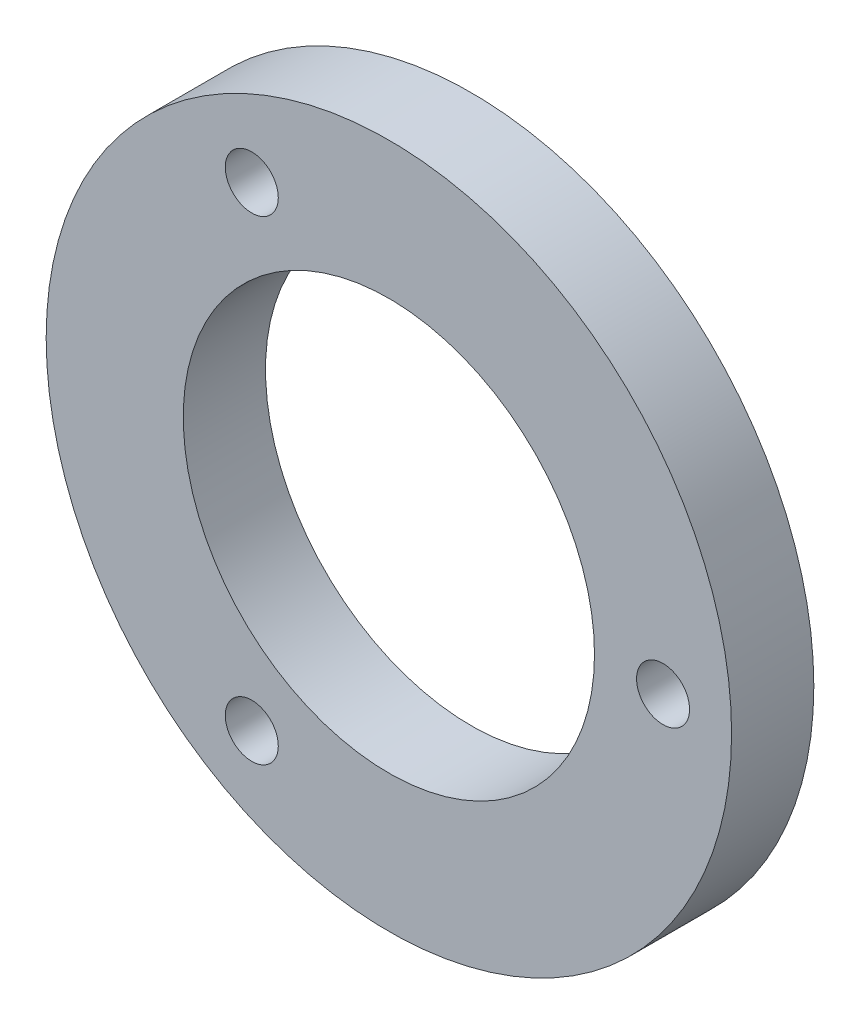
ISO-10303-21;
HEADER;
FILE_DESCRIPTION(('STEP AP214'),'2;1');
FILE_NAME('part.step','',(''),(''),'','','');
FILE_SCHEMA(('AUTOMOTIVE_DESIGN { 1 0 10303 214 1 1 1 1 }'));
ENDSEC;
DATA;
#1=APPLICATION_CONTEXT('core data for automotive mechanical design processes');
#2=APPLICATION_PROTOCOL_DEFINITION('international standard','automotive_design',2000,#1);
#3=PRODUCT_CONTEXT('',#1,'mechanical');
#4=PRODUCT('Part','Part','',(#3));
#5=PRODUCT_RELATED_PRODUCT_CATEGORY('part','',(#4));
#6=PRODUCT_DEFINITION_FORMATION('','',#4);
#7=PRODUCT_DEFINITION_CONTEXT('part definition',#1,'design');
#8=PRODUCT_DEFINITION('design','',#6,#7);
#9=PRODUCT_DEFINITION_SHAPE('','',#8);
#10=(LENGTH_UNIT() NAMED_UNIT(*) SI_UNIT(.MILLI.,.METRE.));
#11=(NAMED_UNIT(*) PLANE_ANGLE_UNIT() SI_UNIT($,.RADIAN.));
#12=(NAMED_UNIT(*) SI_UNIT($,.STERADIAN.) SOLID_ANGLE_UNIT());
#13=UNCERTAINTY_MEASURE_WITH_UNIT(LENGTH_MEASURE(1.E-05),#10,'distance_accuracy_value','');
#14=(GEOMETRIC_REPRESENTATION_CONTEXT(3) GLOBAL_UNCERTAINTY_ASSIGNED_CONTEXT((#13)) GLOBAL_UNIT_ASSIGNED_CONTEXT((#10,
#11,#12)) REPRESENTATION_CONTEXT('',''));
#15=CARTESIAN_POINT('',(0.,0.,0.));
#16=DIRECTION('',(0.,0.,1.));
#17=DIRECTION('',(1.,0.,0.));
#18=AXIS2_PLACEMENT_3D('',#15,#16,#17);
#19=CARTESIAN_POINT('',(0.,0.,9.));
#20=DIRECTION('',(0.,0.,-1.));
#21=DIRECTION('',(-1.,0.,0.));
#22=AXIS2_PLACEMENT_3D('',#19,#20,#21);
#23=CYLINDRICAL_SURFACE('',#22,37.5);
#24=CARTESIAN_POINT('',(0.,0.,9.));
#25=DIRECTION('',(0.,0.,1.));
#26=DIRECTION('',(1.,0.,0.));
#27=AXIS2_PLACEMENT_3D('',#24,#25,#26);
#28=CIRCLE('',#27,37.5);
#29=CARTESIAN_POINT('',(37.5,0.,9.));
#30=VERTEX_POINT('',#29);
#31=EDGE_CURVE('E10',#30,#30,#28,.T.);
#32=ORIENTED_EDGE('',*,*,#31,.F.);
#33=EDGE_LOOP('',(#32));
#34=FACE_BOUND('',#33,.T.);
#35=CARTESIAN_POINT('',(0.,0.,0.));
#36=DIRECTION('',(0.,0.,1.));
#37=DIRECTION('',(1.,0.,0.));
#38=AXIS2_PLACEMENT_3D('',#35,#36,#37);
#39=CIRCLE('',#38,37.5);
#40=CARTESIAN_POINT('',(37.5,0.,0.));
#41=VERTEX_POINT('',#40);
#42=EDGE_CURVE('E42',#41,#41,#39,.T.);
#43=ORIENTED_EDGE('',*,*,#42,.T.);
#44=EDGE_LOOP('',(#43));
#45=FACE_BOUND('',#44,.T.);
#46=ADVANCED_FACE('F35',(#34,#45),#23,.T.);
#47=CARTESIAN_POINT('',(0.,0.,9.));
#48=DIRECTION('',(0.,0.,1.));
#49=DIRECTION('',(1.,0.,0.));
#50=AXIS2_PLACEMENT_3D('',#47,#48,#49);
#51=PLANE('',#50);
#52=CARTESIAN_POINT('',(30.,0.,9.));
#53=DIRECTION('',(0.,0.,1.));
#54=DIRECTION('',(1.,0.,0.));
#55=AXIS2_PLACEMENT_3D('',#52,#53,#54);
#56=CIRCLE('',#55,2.89999999999999);
#57=CARTESIAN_POINT('',(32.9,0.,9.));
#58=VERTEX_POINT('',#57);
#59=EDGE_CURVE('E66',#58,#58,#56,.T.);
#60=ORIENTED_EDGE('',*,*,#59,.F.);
#61=EDGE_LOOP('',(#60));
#62=FACE_BOUND('',#61,.T.);
#63=CARTESIAN_POINT('',(-14.9999999999997,25.9807621135329,9.));
#64=DIRECTION('',(0.,0.,1.));
#65=DIRECTION('',(1.,0.,0.));
#66=AXIS2_PLACEMENT_3D('',#63,#64,#65);
#67=CIRCLE('',#66,2.89999999999999);
#68=CARTESIAN_POINT('',(-12.0999999999997,25.9807621135329,9.));
#69=VERTEX_POINT('',#68);
#70=EDGE_CURVE('E60',#69,#69,#67,.T.);
#71=ORIENTED_EDGE('',*,*,#70,.F.);
#72=EDGE_LOOP('',(#71));
#73=FACE_BOUND('',#72,.T.);
#74=CARTESIAN_POINT('',(-14.9999999999997,-25.980762113533,9.));
#75=DIRECTION('',(0.,0.,1.));
#76=DIRECTION('',(1.,0.,0.));
#77=AXIS2_PLACEMENT_3D('',#74,#75,#76);
#78=CIRCLE('',#77,2.89999999999999);
#79=CARTESIAN_POINT('',(-12.0999999999997,-25.980762113533,9.));
#80=VERTEX_POINT('',#79);
#81=EDGE_CURVE('E54',#80,#80,#78,.T.);
#82=ORIENTED_EDGE('',*,*,#81,.F.);
#83=EDGE_LOOP('',(#82));
#84=FACE_BOUND('',#83,.T.);
#85=CARTESIAN_POINT('',(0.,0.,9.));
#86=DIRECTION('',(0.,0.,1.));
#87=DIRECTION('',(1.,0.,0.));
#88=AXIS2_PLACEMENT_3D('',#85,#86,#87);
#89=CIRCLE('',#88,22.5);
#90=CARTESIAN_POINT('',(22.5,0.,9.));
#91=VERTEX_POINT('',#90);
#92=EDGE_CURVE('E48',#91,#91,#89,.T.);
#93=ORIENTED_EDGE('',*,*,#92,.F.);
#94=EDGE_LOOP('',(#93));
#95=FACE_BOUND('',#94,.T.);
#96=ORIENTED_EDGE('',*,*,#31,.T.);
#97=EDGE_LOOP('',(#96));
#98=FACE_BOUND('',#97,.T.);
#99=ADVANCED_FACE('F73',(#62,#73,#84,#95,#98),#51,.T.);
#100=CARTESIAN_POINT('',(0.,0.,0.));
#101=DIRECTION('',(0.,0.,1.));
#102=DIRECTION('',(1.,0.,0.));
#103=AXIS2_PLACEMENT_3D('',#100,#101,#102);
#104=PLANE('',#103);
#105=CARTESIAN_POINT('',(30.,0.,0.));
#106=DIRECTION('',(0.,0.,1.));
#107=DIRECTION('',(1.,0.,0.));
#108=AXIS2_PLACEMENT_3D('',#105,#106,#107);
#109=CIRCLE('',#108,2.89999999999998);
#110=CARTESIAN_POINT('',(32.9,0.,0.));
#111=VERTEX_POINT('',#110);
#112=EDGE_CURVE('E63',#111,#111,#109,.T.);
#113=ORIENTED_EDGE('',*,*,#112,.T.);
#114=EDGE_LOOP('',(#113));
#115=FACE_BOUND('',#114,.T.);
#116=CARTESIAN_POINT('',(-14.9999999999997,25.9807621135329,0.));
#117=DIRECTION('',(0.,0.,1.));
#118=DIRECTION('',(1.,0.,0.));
#119=AXIS2_PLACEMENT_3D('',#116,#117,#118);
#120=CIRCLE('',#119,2.89999999999998);
#121=CARTESIAN_POINT('',(-12.0999999999997,25.9807621135329,0.));
#122=VERTEX_POINT('',#121);
#123=EDGE_CURVE('E57',#122,#122,#120,.T.);
#124=ORIENTED_EDGE('',*,*,#123,.T.);
#125=EDGE_LOOP('',(#124));
#126=FACE_BOUND('',#125,.T.);
#127=CARTESIAN_POINT('',(-14.9999999999997,-25.980762113533,0.));
#128=DIRECTION('',(0.,0.,1.));
#129=DIRECTION('',(1.,0.,0.));
#130=AXIS2_PLACEMENT_3D('',#127,#128,#129);
#131=CIRCLE('',#130,2.89999999999998);
#132=CARTESIAN_POINT('',(-12.0999999999997,-25.980762113533,0.));
#133=VERTEX_POINT('',#132);
#134=EDGE_CURVE('E51',#133,#133,#131,.T.);
#135=ORIENTED_EDGE('',*,*,#134,.T.);
#136=EDGE_LOOP('',(#135));
#137=FACE_BOUND('',#136,.T.);
#138=CARTESIAN_POINT('',(0.,0.,0.));
#139=DIRECTION('',(0.,0.,1.));
#140=DIRECTION('',(1.,0.,0.));
#141=AXIS2_PLACEMENT_3D('',#138,#139,#140);
#142=CIRCLE('',#141,22.5);
#143=CARTESIAN_POINT('',(22.5,0.,0.));
#144=VERTEX_POINT('',#143);
#145=EDGE_CURVE('E38',#144,#144,#142,.T.);
#146=ORIENTED_EDGE('',*,*,#145,.T.);
#147=EDGE_LOOP('',(#146));
#148=FACE_BOUND('',#147,.T.);
#149=ORIENTED_EDGE('',*,*,#42,.F.);
#150=EDGE_LOOP('',(#149));
#151=FACE_BOUND('',#150,.T.);
#152=ADVANCED_FACE('F76',(#115,#126,#137,#148,#151),#104,.F.);
#153=CARTESIAN_POINT('',(0.,0.,-21.5));
#154=DIRECTION('',(0.,0.,1.));
#155=DIRECTION('',(1.,0.,0.));
#156=AXIS2_PLACEMENT_3D('',#153,#154,#155);
#157=CYLINDRICAL_SURFACE('',#156,22.5);
#158=CARTESIAN_POINT('',(22.5,0.,9.));
#159=CARTESIAN_POINT('',(22.5,0.,8.90625));
#160=CARTESIAN_POINT('',(22.5,0.,8.8125));
#161=CARTESIAN_POINT('',(22.5,0.,8.625));
#162=CARTESIAN_POINT('',(22.5,0.,8.53125));
#163=CARTESIAN_POINT('',(22.5,0.,8.34375));
#164=CARTESIAN_POINT('',(22.5,0.,8.25));
#165=CARTESIAN_POINT('',(22.5,0.,8.0625));
#166=CARTESIAN_POINT('',(22.5,0.,7.96875));
#167=CARTESIAN_POINT('',(22.5,0.,7.78125));
#168=CARTESIAN_POINT('',(22.5,0.,7.6875));
#169=CARTESIAN_POINT('',(22.5,0.,7.5));
#170=CARTESIAN_POINT('',(22.5,0.,7.40625));
#171=CARTESIAN_POINT('',(22.5,0.,7.21875));
#172=CARTESIAN_POINT('',(22.5,0.,7.125));
#173=CARTESIAN_POINT('',(22.5,0.,6.9375));
#174=CARTESIAN_POINT('',(22.5,0.,6.84375));
#175=CARTESIAN_POINT('',(22.5,0.,6.65625));
#176=CARTESIAN_POINT('',(22.5,0.,6.5625));
#177=CARTESIAN_POINT('',(22.5,0.,6.375));
#178=CARTESIAN_POINT('',(22.5,0.,6.28125));
#179=CARTESIAN_POINT('',(22.5,0.,6.09375));
#180=CARTESIAN_POINT('',(22.5,0.,6.));
#181=CARTESIAN_POINT('',(22.5,0.,5.8125));
#182=CARTESIAN_POINT('',(22.5,0.,5.71875));
#183=CARTESIAN_POINT('',(22.5,0.,5.53125));
#184=CARTESIAN_POINT('',(22.5,0.,5.4375));
#185=CARTESIAN_POINT('',(22.5,0.,5.25));
#186=CARTESIAN_POINT('',(22.5,0.,5.15625));
#187=CARTESIAN_POINT('',(22.5,0.,4.96875));
#188=CARTESIAN_POINT('',(22.5,0.,4.875));
#189=CARTESIAN_POINT('',(22.5,0.,4.6875));
#190=CARTESIAN_POINT('',(22.5,0.,4.59375));
#191=CARTESIAN_POINT('',(22.5,0.,4.40625));
#192=CARTESIAN_POINT('',(22.5,0.,4.3125));
#193=CARTESIAN_POINT('',(22.5,0.,4.125));
#194=CARTESIAN_POINT('',(22.5,0.,4.03125));
#195=CARTESIAN_POINT('',(22.5,0.,3.84375));
#196=CARTESIAN_POINT('',(22.5,0.,3.75));
#197=CARTESIAN_POINT('',(22.5,0.,3.5625));
#198=CARTESIAN_POINT('',(22.5,0.,3.46875));
#199=CARTESIAN_POINT('',(22.5,0.,3.28125));
#200=CARTESIAN_POINT('',(22.5,0.,3.1875));
#201=CARTESIAN_POINT('',(22.5,0.,3.));
#202=CARTESIAN_POINT('',(22.5,0.,2.90625));
#203=CARTESIAN_POINT('',(22.5,0.,2.71875));
#204=CARTESIAN_POINT('',(22.5,0.,2.625));
#205=CARTESIAN_POINT('',(22.5,0.,2.4375));
#206=CARTESIAN_POINT('',(22.5,0.,2.34375));
#207=CARTESIAN_POINT('',(22.5,0.,2.15625));
#208=CARTESIAN_POINT('',(22.5,0.,2.0625));
#209=CARTESIAN_POINT('',(22.5,0.,1.875));
#210=CARTESIAN_POINT('',(22.5,0.,1.78125));
#211=CARTESIAN_POINT('',(22.5,0.,1.59375));
#212=CARTESIAN_POINT('',(22.5,0.,1.5));
#213=CARTESIAN_POINT('',(22.5,0.,1.3125));
#214=CARTESIAN_POINT('',(22.5,0.,1.21875));
#215=CARTESIAN_POINT('',(22.5,0.,1.03125));
#216=CARTESIAN_POINT('',(22.5,0.,0.937499999999997));
#217=CARTESIAN_POINT('',(22.5,0.,0.749999999999997));
#218=CARTESIAN_POINT('',(22.5,0.,0.656249999999997));
#219=CARTESIAN_POINT('',(22.5,0.,0.468749999999997));
#220=CARTESIAN_POINT('',(22.5,0.,0.374999999999997));
#221=CARTESIAN_POINT('',(22.5,0.,0.187499999999997));
#222=CARTESIAN_POINT('',(22.5,0.,0.0937499999999966));
#223=CARTESIAN_POINT('',(22.5,0.,0.));
#224=B_SPLINE_CURVE_WITH_KNOTS('',3,(#158,#159,#160,#161,#162,#163,#164,#165,#166,#167,#168,
#169,#170,#171,#172,#173,#174,#175,#176,#177,#178,#179,#180,#181,#182,#183,#184,#185,#186,#187,
#188,#189,#190,#191,#192,#193,#194,#195,#196,#197,#198,#199,#200,#201,#202,#203,#204,#205,#206,
#207,#208,#209,#210,#211,#212,#213,#214,#215,#216,#217,#218,#219,#220,#221,#222,#223),
.UNSPECIFIED.,.F.,.F.,(4,2,2,2,2,2,2,2,2,2,2,2,2,2,2,2,2,2,2,2,2,2,2,2,2,2,2,2,2,2,2,2,4),(0.,
0.28125,0.5625,0.843750000000001,1.125,1.40625,1.6875,1.96875,2.25,2.53125,2.8125,3.09375,3.375,
3.65625,3.9375,4.21875,4.5,4.78125,5.0625,5.34375,5.625,5.90625,6.1875,6.46875,6.75,7.03125,
7.3125,7.59375,7.875,8.15625,8.4375,8.71875,9.),.UNSPECIFIED.);
#225=EDGE_CURVE('BSEAM84',#91,#144,#224,.T.);
#226=ORIENTED_EDGE('',*,*,#92,.T.);
#227=ORIENTED_EDGE('',*,*,#145,.F.);
#228=ORIENTED_EDGE('',*,*,#225,.T.);
#229=ORIENTED_EDGE('',*,*,#225,.F.);
#230=EDGE_LOOP('',(#226,#228,#227,#229));
#231=FACE_BOUND('',#230,.T.);
#232=ADVANCED_FACE('F84',(#231),#157,.F.);
#233=CARTESIAN_POINT('',(-14.9999999999997,-25.980762113533,9.));
#234=DIRECTION('',(0.,0.,1.));
#235=DIRECTION('',(1.,0.,0.));
#236=AXIS2_PLACEMENT_3D('',#233,#234,#235);
#237=CYLINDRICAL_SURFACE('',#236,2.89999999999998);
#238=ORIENTED_EDGE('',*,*,#81,.T.);
#239=EDGE_LOOP('',(#238));
#240=FACE_BOUND('',#239,.T.);
#241=ORIENTED_EDGE('',*,*,#134,.F.);
#242=EDGE_LOOP('',(#241));
#243=FACE_BOUND('',#242,.T.);
#244=ADVANCED_FACE('F87',(#240,#243),#237,.F.);
#245=CARTESIAN_POINT('',(-14.9999999999997,25.9807621135329,9.));
#246=DIRECTION('',(0.,0.,1.));
#247=DIRECTION('',(1.,0.,0.));
#248=AXIS2_PLACEMENT_3D('',#245,#246,#247);
#249=CYLINDRICAL_SURFACE('',#248,2.89999999999998);
#250=ORIENTED_EDGE('',*,*,#70,.T.);
#251=EDGE_LOOP('',(#250));
#252=FACE_BOUND('',#251,.T.);
#253=ORIENTED_EDGE('',*,*,#123,.F.);
#254=EDGE_LOOP('',(#253));
#255=FACE_BOUND('',#254,.T.);
#256=ADVANCED_FACE('F125',(#252,#255),#249,.F.);
#257=CARTESIAN_POINT('',(30.,0.,9.));
#258=DIRECTION('',(0.,0.,1.));
#259=DIRECTION('',(1.,0.,0.));
#260=AXIS2_PLACEMENT_3D('',#257,#258,#259);
#261=CYLINDRICAL_SURFACE('',#260,2.89999999999998);
#262=ORIENTED_EDGE('',*,*,#59,.T.);
#263=EDGE_LOOP('',(#262));
#264=FACE_BOUND('',#263,.T.);
#265=ORIENTED_EDGE('',*,*,#112,.F.);
#266=EDGE_LOOP('',(#265));
#267=FACE_BOUND('',#266,.T.);
#268=ADVANCED_FACE('F70',(#264,#267),#261,.F.);
#269=CLOSED_SHELL('',(#46,#99,#152,#232,#244,#256,#268));
#270=MANIFOLD_SOLID_BREP('B2',#269);
#271=ADVANCED_BREP_SHAPE_REPRESENTATION('',(#18,#270),#14);
#272=SHAPE_DEFINITION_REPRESENTATION(#9,#271);
ENDSEC;
END-ISO-10303-21;
